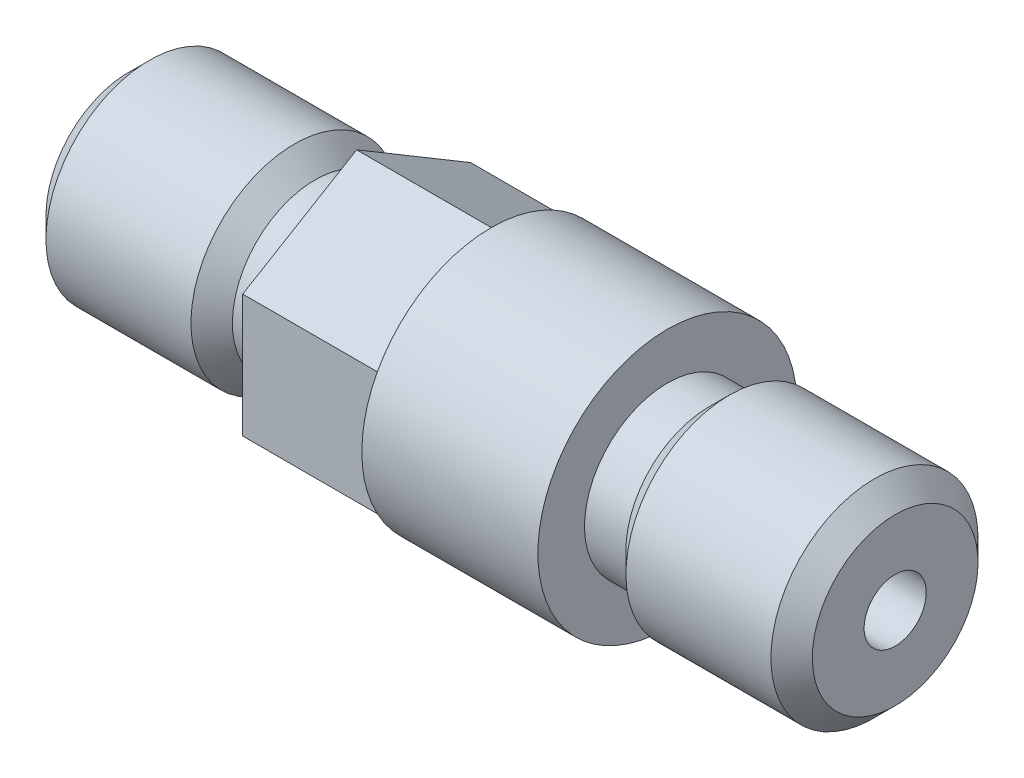
ISO-10303-21;
HEADER;
FILE_DESCRIPTION(('STEP AP214'),'2;1');
FILE_NAME('part.step','',(''),(''),'','','');
FILE_SCHEMA(('AUTOMOTIVE_DESIGN { 1 0 10303 214 1 1 1 1 }'));
ENDSEC;
DATA;
#1=APPLICATION_CONTEXT('core data for automotive mechanical design processes');
#2=APPLICATION_PROTOCOL_DEFINITION('international standard','automotive_design',2000,#1);
#3=PRODUCT_CONTEXT('',#1,'mechanical');
#4=PRODUCT('Part','Part','',(#3));
#5=PRODUCT_RELATED_PRODUCT_CATEGORY('part','',(#4));
#6=PRODUCT_DEFINITION_FORMATION('','',#4);
#7=PRODUCT_DEFINITION_CONTEXT('part definition',#1,'design');
#8=PRODUCT_DEFINITION('design','',#6,#7);
#9=PRODUCT_DEFINITION_SHAPE('','',#8);
#10=(LENGTH_UNIT() NAMED_UNIT(*) SI_UNIT(.MILLI.,.METRE.));
#11=(NAMED_UNIT(*) PLANE_ANGLE_UNIT() SI_UNIT($,.RADIAN.));
#12=(NAMED_UNIT(*) SI_UNIT($,.STERADIAN.) SOLID_ANGLE_UNIT());
#13=UNCERTAINTY_MEASURE_WITH_UNIT(LENGTH_MEASURE(1.E-05),#10,'distance_accuracy_value','');
#14=(GEOMETRIC_REPRESENTATION_CONTEXT(3) GLOBAL_UNCERTAINTY_ASSIGNED_CONTEXT((#13)) GLOBAL_UNIT_ASSIGNED_CONTEXT((#10,
#11,#12)) REPRESENTATION_CONTEXT('',''));
#15=CARTESIAN_POINT('',(0.,0.,0.));
#16=DIRECTION('',(0.,0.,1.));
#17=DIRECTION('',(1.,0.,0.));
#18=AXIS2_PLACEMENT_3D('',#15,#16,#17);
#19=CARTESIAN_POINT('',(-19.5,6.25,0.));
#20=DIRECTION('',(-1.,0.,0.));
#21=DIRECTION('',(0.,-1.,0.));
#22=AXIS2_PLACEMENT_3D('',#19,#20,#21);
#23=PLANE('',#22);
#24=DIRECTION('',(0.,-0.512360379283217,-0.858770540796992));
#25=VECTOR('',#24,1.);
#26=CARTESIAN_POINT('',(-19.5,2.96858552175948,-5.5));
#27=LINE('',#26,#25);
#28=CARTESIAN_POINT('',(-19.5,6.25,0.));
#29=VERTEX_POINT('',#28);
#30=CARTESIAN_POINT('',(-19.5,2.96858552175947,-5.5));
#31=VERTEX_POINT('',#30);
#32=EDGE_CURVE('E121',#29,#31,#27,.T.);
#33=ORIENTED_EDGE('',*,*,#32,.F.);
#34=CARTESIAN_POINT('',(-19.5,0.,0.));
#35=DIRECTION('',(1.,0.,0.));
#36=DIRECTION('',(0.,1.,0.));
#37=AXIS2_PLACEMENT_3D('',#34,#35,#36);
#38=CIRCLE('',#37,6.25);
#39=EDGE_CURVE('E123',#31,#29,#38,.T.);
#40=ORIENTED_EDGE('',*,*,#39,.F.);
#41=EDGE_LOOP('',(#33,#40));
#42=FACE_BOUND('',#41,.T.);
#43=ADVANCED_FACE('F39',(#42),#23,.T.);
#44=DIRECTION('',(0.,0.512360379283217,-0.858770540796992));
#45=VECTOR('',#44,1.);
#46=CARTESIAN_POINT('',(-19.5,6.25,0.));
#47=LINE('',#46,#45);
#48=CARTESIAN_POINT('',(-19.5,2.96858552175947,5.5));
#49=VERTEX_POINT('',#48);
#50=EDGE_CURVE('E118',#49,#29,#47,.T.);
#51=ORIENTED_EDGE('',*,*,#50,.F.);
#52=EDGE_CURVE('E130',#29,#49,#38,.T.);
#53=ORIENTED_EDGE('',*,*,#52,.F.);
#54=EDGE_LOOP('',(#51,#53));
#55=FACE_BOUND('',#54,.T.);
#56=ADVANCED_FACE('F176',(#55),#23,.T.);
#57=DIRECTION('',(0.,1.,0.));
#58=VECTOR('',#57,1.);
#59=CARTESIAN_POINT('',(-19.5,2.96858552175947,5.5));
#60=LINE('',#59,#58);
#61=CARTESIAN_POINT('',(-19.5,-2.96858552175948,5.5));
#62=VERTEX_POINT('',#61);
#63=EDGE_CURVE('E232',#62,#49,#60,.T.);
#64=ORIENTED_EDGE('',*,*,#63,.F.);
#65=EDGE_CURVE('E138',#49,#62,#38,.T.);
#66=ORIENTED_EDGE('',*,*,#65,.F.);
#67=EDGE_LOOP('',(#64,#66));
#68=FACE_BOUND('',#67,.T.);
#69=ADVANCED_FACE('F183',(#68),#23,.T.);
#70=DIRECTION('',(0.,0.512360379283217,0.858770540796992));
#71=VECTOR('',#70,1.);
#72=CARTESIAN_POINT('',(-19.5,-6.25,0.));
#73=LINE('',#72,#71);
#74=CARTESIAN_POINT('',(-19.5,-6.25,0.));
#75=VERTEX_POINT('',#74);
#76=EDGE_CURVE('E62',#75,#62,#73,.T.);
#77=ORIENTED_EDGE('',*,*,#76,.F.);
#78=EDGE_CURVE('E263',#62,#75,#38,.T.);
#79=ORIENTED_EDGE('',*,*,#78,.F.);
#80=EDGE_LOOP('',(#77,#79));
#81=FACE_BOUND('',#80,.T.);
#82=ADVANCED_FACE('F196',(#81),#23,.T.);
#83=DIRECTION('',(0.,-0.512360379283217,0.858770540796992));
#84=VECTOR('',#83,1.);
#85=CARTESIAN_POINT('',(-19.5,-2.96858552175948,-5.5));
#86=LINE('',#85,#84);
#87=CARTESIAN_POINT('',(-19.5,-2.96858552175948,-5.5));
#88=VERTEX_POINT('',#87);
#89=EDGE_CURVE('E203',#88,#75,#86,.T.);
#90=ORIENTED_EDGE('',*,*,#89,.F.);
#91=EDGE_CURVE('E204',#75,#88,#38,.T.);
#92=ORIENTED_EDGE('',*,*,#91,.F.);
#93=EDGE_LOOP('',(#90,#92));
#94=FACE_BOUND('',#93,.T.);
#95=ADVANCED_FACE('F173',(#94),#23,.T.);
#96=CARTESIAN_POINT('',(0.,0.,0.));
#97=DIRECTION('',(1.,0.,0.));
#98=DIRECTION('',(0.,1.,0.));
#99=AXIS2_PLACEMENT_3D('',#96,#97,#98);
#100=PLANE('',#99);
#101=CARTESIAN_POINT('',(0.,0.,0.));
#102=DIRECTION('',(-1.,0.,0.));
#103=DIRECTION('',(0.,-1.,0.));
#104=AXIS2_PLACEMENT_3D('',#101,#102,#103);
#105=CIRCLE('',#104,1.5);
#106=CARTESIAN_POINT('',(0.,-1.5,0.));
#107=VERTEX_POINT('',#106);
#108=EDGE_CURVE('E470',#107,#107,#105,.T.);
#109=ORIENTED_EDGE('',*,*,#108,.T.);
#110=EDGE_LOOP('',(#109));
#111=FACE_BOUND('',#110,.T.);
#112=CARTESIAN_POINT('',(0.,0.,0.));
#113=DIRECTION('',(1.,0.,0.));
#114=DIRECTION('',(0.,1.,0.));
#115=AXIS2_PLACEMENT_3D('',#112,#113,#114);
#116=CIRCLE('',#115,4.);
#117=CARTESIAN_POINT('',(0.,4.,0.));
#118=VERTEX_POINT('',#117);
#119=EDGE_CURVE('E43',#118,#118,#116,.T.);
#120=ORIENTED_EDGE('',*,*,#119,.T.);
#121=EDGE_LOOP('',(#120));
#122=FACE_BOUND('',#121,.T.);
#123=ADVANCED_FACE('F41',(#111,#122),#100,.T.);
#124=CARTESIAN_POINT('',(0.,0.,0.));
#125=DIRECTION('',(-1.,0.,0.));
#126=DIRECTION('',(0.,-1.,0.));
#127=AXIS2_PLACEMENT_3D('',#124,#125,#126);
#128=CONICAL_SURFACE('',#127,4.,0.785398163397447);
#129=CARTESIAN_POINT('',(-1.,0.,0.));
#130=DIRECTION('',(1.,0.,0.));
#131=DIRECTION('',(0.,1.,0.));
#132=AXIS2_PLACEMENT_3D('',#129,#130,#131);
#133=CIRCLE('',#132,5.);
#134=CARTESIAN_POINT('',(-1.,5.,0.));
#135=VERTEX_POINT('',#134);
#136=EDGE_CURVE('E153',#135,#135,#133,.T.);
#137=ORIENTED_EDGE('',*,*,#136,.T.);
#138=EDGE_LOOP('',(#137));
#139=FACE_BOUND('',#138,.T.);
#140=ORIENTED_EDGE('',*,*,#119,.F.);
#141=EDGE_LOOP('',(#140));
#142=FACE_BOUND('',#141,.T.);
#143=ADVANCED_FACE('F163',(#139,#142),#128,.T.);
#144=CARTESIAN_POINT('',(0.,0.,0.));
#145=DIRECTION('',(1.,0.,0.));
#146=DIRECTION('',(0.,1.,0.));
#147=AXIS2_PLACEMENT_3D('',#144,#145,#146);
#148=CYLINDRICAL_SURFACE('',#147,5.);
#149=CARTESIAN_POINT('',(-8.,0.,0.));
#150=DIRECTION('',(1.,0.,0.));
#151=DIRECTION('',(0.,1.,0.));
#152=AXIS2_PLACEMENT_3D('',#149,#150,#151);
#153=CIRCLE('',#152,5.);
#154=CARTESIAN_POINT('',(-8.,5.,0.));
#155=VERTEX_POINT('',#154);
#156=EDGE_CURVE('E150',#155,#155,#153,.T.);
#157=ORIENTED_EDGE('',*,*,#156,.T.);
#158=EDGE_LOOP('',(#157));
#159=FACE_BOUND('',#158,.T.);
#160=ORIENTED_EDGE('',*,*,#136,.F.);
#161=EDGE_LOOP('',(#160));
#162=FACE_BOUND('',#161,.T.);
#163=ADVANCED_FACE('F165',(#159,#162),#148,.T.);
#164=CARTESIAN_POINT('',(-8.,0.,0.));
#165=DIRECTION('',(1.,0.,0.));
#166=DIRECTION('',(0.,1.,0.));
#167=AXIS2_PLACEMENT_3D('',#164,#165,#166);
#168=CONICAL_SURFACE('',#167,5.,0.785398163397453);
#169=CARTESIAN_POINT('',(-9.,0.,0.));
#170=DIRECTION('',(1.,0.,0.));
#171=DIRECTION('',(0.,1.,0.));
#172=AXIS2_PLACEMENT_3D('',#169,#170,#171);
#173=CIRCLE('',#172,3.99999999999999);
#174=CARTESIAN_POINT('',(-9.,3.99999999999999,0.));
#175=VERTEX_POINT('',#174);
#176=EDGE_CURVE('E146',#175,#175,#173,.T.);
#177=ORIENTED_EDGE('',*,*,#176,.T.);
#178=EDGE_LOOP('',(#177));
#179=FACE_BOUND('',#178,.T.);
#180=ORIENTED_EDGE('',*,*,#156,.F.);
#181=EDGE_LOOP('',(#180));
#182=FACE_BOUND('',#181,.T.);
#183=ADVANCED_FACE('F170',(#179,#182),#168,.T.);
#184=CARTESIAN_POINT('',(0.,0.,0.));
#185=DIRECTION('',(1.,0.,0.));
#186=DIRECTION('',(0.,1.,0.));
#187=AXIS2_PLACEMENT_3D('',#184,#185,#186);
#188=CYLINDRICAL_SURFACE('',#187,3.99999999999999);
#189=CARTESIAN_POINT('',(-11.,0.,0.));
#190=DIRECTION('',(1.,0.,0.));
#191=DIRECTION('',(0.,1.,0.));
#192=AXIS2_PLACEMENT_3D('',#189,#190,#191);
#193=CIRCLE('',#192,3.99999999999999);
#194=CARTESIAN_POINT('',(-11.,3.99999999999999,0.));
#195=VERTEX_POINT('',#194);
#196=EDGE_CURVE('E142',#195,#195,#193,.T.);
#197=ORIENTED_EDGE('',*,*,#196,.T.);
#198=EDGE_LOOP('',(#197));
#199=FACE_BOUND('',#198,.T.);
#200=ORIENTED_EDGE('',*,*,#176,.F.);
#201=EDGE_LOOP('',(#200));
#202=FACE_BOUND('',#201,.T.);
#203=ADVANCED_FACE('F273',(#199,#202),#188,.T.);
#204=CARTESIAN_POINT('',(-11.,3.99999999999999,0.));
#205=DIRECTION('',(1.,0.,0.));
#206=DIRECTION('',(0.,1.,0.));
#207=AXIS2_PLACEMENT_3D('',#204,#205,#206);
#208=PLANE('',#207);
#209=CARTESIAN_POINT('',(-11.,0.,0.));
#210=DIRECTION('',(1.,0.,0.));
#211=DIRECTION('',(0.,1.,0.));
#212=AXIS2_PLACEMENT_3D('',#209,#210,#211);
#213=CIRCLE('',#212,6.25);
#214=CARTESIAN_POINT('',(-11.,6.25,0.));
#215=VERTEX_POINT('',#214);
#216=EDGE_CURVE('E137',#215,#215,#213,.T.);
#217=ORIENTED_EDGE('',*,*,#216,.T.);
#218=EDGE_LOOP('',(#217));
#219=FACE_BOUND('',#218,.T.);
#220=ORIENTED_EDGE('',*,*,#196,.F.);
#221=EDGE_LOOP('',(#220));
#222=FACE_BOUND('',#221,.T.);
#223=ADVANCED_FACE('F193',(#219,#222),#208,.T.);
#224=CARTESIAN_POINT('',(0.,0.,0.));
#225=DIRECTION('',(1.,0.,0.));
#226=DIRECTION('',(0.,1.,0.));
#227=AXIS2_PLACEMENT_3D('',#224,#225,#226);
#228=CYLINDRICAL_SURFACE('',#227,6.25);
#229=ORIENTED_EDGE('',*,*,#52,.T.);
#230=ORIENTED_EDGE('',*,*,#65,.T.);
#231=ORIENTED_EDGE('',*,*,#78,.T.);
#232=ORIENTED_EDGE('',*,*,#91,.T.);
#233=EDGE_CURVE('E128',#88,#31,#38,.T.);
#234=ORIENTED_EDGE('',*,*,#233,.T.);
#235=ORIENTED_EDGE('',*,*,#39,.T.);
#236=EDGE_LOOP('',(#229,#230,#231,#232,#234,#235));
#237=FACE_BOUND('',#236,.T.);
#238=ORIENTED_EDGE('',*,*,#216,.F.);
#239=EDGE_LOOP('',(#238));
#240=FACE_BOUND('',#239,.T.);
#241=ADVANCED_FACE('F188',(#237,#240),#228,.T.);
#242=DIRECTION('',(0.,-1.,0.));
#243=VECTOR('',#242,1.);
#244=CARTESIAN_POINT('',(-19.5,2.96858552175948,-5.5));
#245=LINE('',#244,#243);
#246=EDGE_CURVE('E55',#31,#88,#245,.T.);
#247=ORIENTED_EDGE('',*,*,#246,.F.);
#248=ORIENTED_EDGE('',*,*,#233,.F.);
#249=EDGE_LOOP('',(#247,#248));
#250=FACE_BOUND('',#249,.T.);
#251=ADVANCED_FACE('F179',(#250),#23,.T.);
#252=CARTESIAN_POINT('',(-26.,2.96858552175948,-5.5));
#253=DIRECTION('',(0.,-0.858770540796992,0.512360379283217));
#254=DIRECTION('',(0.,-0.512360379283217,-0.858770540796992));
#255=AXIS2_PLACEMENT_3D('',#252,#253,#254);
#256=PLANE('',#255);
#257=ORIENTED_EDGE('',*,*,#32,.T.);
#258=DIRECTION('',(1.,0.,0.));
#259=VECTOR('',#258,1.);
#260=CARTESIAN_POINT('',(-26.,2.96858552175948,-5.5));
#261=LINE('',#260,#259);
#262=CARTESIAN_POINT('',(-26.,2.96858552175948,-5.5));
#263=VERTEX_POINT('',#262);
#264=EDGE_CURVE('E100',#263,#31,#261,.T.);
#265=ORIENTED_EDGE('',*,*,#264,.F.);
#266=DIRECTION('',(0.,-0.512360379283217,-0.858770540796992));
#267=VECTOR('',#266,1.);
#268=CARTESIAN_POINT('',(-26.,2.96858552175948,-5.5));
#269=LINE('',#268,#267);
#270=CARTESIAN_POINT('',(-26.,6.25,0.));
#271=VERTEX_POINT('',#270);
#272=EDGE_CURVE('E108',#271,#263,#269,.T.);
#273=ORIENTED_EDGE('',*,*,#272,.F.);
#274=DIRECTION('',(1.,0.,0.));
#275=VECTOR('',#274,1.);
#276=CARTESIAN_POINT('',(-26.,6.25,0.));
#277=LINE('',#276,#275);
#278=EDGE_CURVE('E226',#271,#29,#277,.T.);
#279=ORIENTED_EDGE('',*,*,#278,.T.);
#280=EDGE_LOOP('',(#257,#265,#273,#279));
#281=FACE_BOUND('',#280,.T.);
#282=ADVANCED_FACE('F120',(#281),#256,.F.);
#283=CARTESIAN_POINT('',(-26.,2.96858552175948,-5.5));
#284=DIRECTION('',(0.,0.,1.));
#285=DIRECTION('',(1.,0.,0.));
#286=AXIS2_PLACEMENT_3D('',#283,#284,#285);
#287=PLANE('',#286);
#288=ORIENTED_EDGE('',*,*,#246,.T.);
#289=DIRECTION('',(1.,0.,0.));
#290=VECTOR('',#289,1.);
#291=CARTESIAN_POINT('',(-26.,-2.96858552175948,-5.5));
#292=LINE('',#291,#290);
#293=CARTESIAN_POINT('',(-26.,-2.96858552175948,-5.5));
#294=VERTEX_POINT('',#293);
#295=EDGE_CURVE('E103',#294,#88,#292,.T.);
#296=ORIENTED_EDGE('',*,*,#295,.F.);
#297=DIRECTION('',(0.,-1.,0.));
#298=VECTOR('',#297,1.);
#299=CARTESIAN_POINT('',(-26.,2.96858552175948,-5.5));
#300=LINE('',#299,#298);
#301=EDGE_CURVE('E96',#263,#294,#300,.T.);
#302=ORIENTED_EDGE('',*,*,#301,.F.);
#303=ORIENTED_EDGE('',*,*,#264,.T.);
#304=EDGE_LOOP('',(#288,#296,#302,#303));
#305=FACE_BOUND('',#304,.T.);
#306=ADVANCED_FACE('F98',(#305),#287,.F.);
#307=CARTESIAN_POINT('',(-26.,-2.96858552175948,-5.5));
#308=DIRECTION('',(0.,0.858770540796992,0.512360379283217));
#309=DIRECTION('',(0.,-0.512360379283217,0.858770540796992));
#310=AXIS2_PLACEMENT_3D('',#307,#308,#309);
#311=PLANE('',#310);
#312=ORIENTED_EDGE('',*,*,#89,.T.);
#313=DIRECTION('',(1.,0.,0.));
#314=VECTOR('',#313,1.);
#315=CARTESIAN_POINT('',(-26.,-6.25,0.));
#316=LINE('',#315,#314);
#317=CARTESIAN_POINT('',(-26.,-6.25,0.));
#318=VERTEX_POINT('',#317);
#319=EDGE_CURVE('E131',#318,#75,#316,.T.);
#320=ORIENTED_EDGE('',*,*,#319,.F.);
#321=DIRECTION('',(0.,-0.512360379283217,0.858770540796992));
#322=VECTOR('',#321,1.);
#323=CARTESIAN_POINT('',(-26.,-2.96858552175948,-5.5));
#324=LINE('',#323,#322);
#325=EDGE_CURVE('E107',#294,#318,#324,.T.);
#326=ORIENTED_EDGE('',*,*,#325,.F.);
#327=ORIENTED_EDGE('',*,*,#295,.T.);
#328=EDGE_LOOP('',(#312,#320,#326,#327));
#329=FACE_BOUND('',#328,.T.);
#330=ADVANCED_FACE('F213',(#329),#311,.F.);
#331=CARTESIAN_POINT('',(-26.,-6.25,0.));
#332=DIRECTION('',(0.,0.858770540796992,-0.512360379283217));
#333=DIRECTION('',(0.,0.512360379283217,0.858770540796992));
#334=AXIS2_PLACEMENT_3D('',#331,#332,#333);
#335=PLANE('',#334);
#336=ORIENTED_EDGE('',*,*,#76,.T.);
#337=DIRECTION('',(1.,0.,0.));
#338=VECTOR('',#337,1.);
#339=CARTESIAN_POINT('',(-26.,-2.96858552175948,5.5));
#340=LINE('',#339,#338);
#341=CARTESIAN_POINT('',(-26.,-2.96858552175948,5.5));
#342=VERTEX_POINT('',#341);
#343=EDGE_CURVE('E245',#342,#62,#340,.T.);
#344=ORIENTED_EDGE('',*,*,#343,.F.);
#345=DIRECTION('',(0.,0.512360379283217,0.858770540796992));
#346=VECTOR('',#345,1.);
#347=CARTESIAN_POINT('',(-26.,-6.25,0.));
#348=LINE('',#347,#346);
#349=EDGE_CURVE('E216',#318,#342,#348,.T.);
#350=ORIENTED_EDGE('',*,*,#349,.F.);
#351=ORIENTED_EDGE('',*,*,#319,.T.);
#352=EDGE_LOOP('',(#336,#344,#350,#351));
#353=FACE_BOUND('',#352,.T.);
#354=ADVANCED_FACE('F250',(#353),#335,.F.);
#355=CARTESIAN_POINT('',(-26.,2.96858552175947,5.5));
#356=DIRECTION('',(0.,0.,-1.));
#357=DIRECTION('',(-1.,0.,0.));
#358=AXIS2_PLACEMENT_3D('',#355,#356,#357);
#359=PLANE('',#358);
#360=ORIENTED_EDGE('',*,*,#63,.T.);
#361=DIRECTION('',(1.,0.,0.));
#362=VECTOR('',#361,1.);
#363=CARTESIAN_POINT('',(-26.,2.96858552175947,5.5));
#364=LINE('',#363,#362);
#365=CARTESIAN_POINT('',(-26.,2.96858552175947,5.5));
#366=VERTEX_POINT('',#365);
#367=EDGE_CURVE('E241',#366,#49,#364,.T.);
#368=ORIENTED_EDGE('',*,*,#367,.F.);
#369=DIRECTION('',(0.,1.,0.));
#370=VECTOR('',#369,1.);
#371=CARTESIAN_POINT('',(-26.,2.96858552175947,5.5));
#372=LINE('',#371,#370);
#373=EDGE_CURVE('E219',#342,#366,#372,.T.);
#374=ORIENTED_EDGE('',*,*,#373,.F.);
#375=ORIENTED_EDGE('',*,*,#343,.T.);
#376=EDGE_LOOP('',(#360,#368,#374,#375));
#377=FACE_BOUND('',#376,.T.);
#378=ADVANCED_FACE('F255',(#377),#359,.F.);
#379=CARTESIAN_POINT('',(-26.,6.25,0.));
#380=DIRECTION('',(0.,-0.858770540796992,-0.512360379283217));
#381=DIRECTION('',(0.,0.512360379283217,-0.858770540796992));
#382=AXIS2_PLACEMENT_3D('',#379,#380,#381);
#383=PLANE('',#382);
#384=ORIENTED_EDGE('',*,*,#50,.T.);
#385=ORIENTED_EDGE('',*,*,#278,.F.);
#386=DIRECTION('',(0.,0.512360379283217,-0.858770540796992));
#387=VECTOR('',#386,1.);
#388=CARTESIAN_POINT('',(-26.,6.25,0.));
#389=LINE('',#388,#387);
#390=EDGE_CURVE('E113',#366,#271,#389,.T.);
#391=ORIENTED_EDGE('',*,*,#390,.F.);
#392=ORIENTED_EDGE('',*,*,#367,.T.);
#393=EDGE_LOOP('',(#384,#385,#391,#392));
#394=FACE_BOUND('',#393,.T.);
#395=ADVANCED_FACE('F257',(#394),#383,.F.);
#396=CARTESIAN_POINT('',(-26.,0.,0.));
#397=DIRECTION('',(1.,0.,0.));
#398=DIRECTION('',(0.,0.,-1.));
#399=AXIS2_PLACEMENT_3D('',#396,#397,#398);
#400=PLANE('',#399);
#401=CARTESIAN_POINT('',(-26.,0.,0.));
#402=DIRECTION('',(-1.,0.,0.));
#403=DIRECTION('',(0.,-1.,0.));
#404=AXIS2_PLACEMENT_3D('',#401,#402,#403);
#405=CIRCLE('',#404,3.99999999999999);
#406=CARTESIAN_POINT('',(-26.,-3.99999999999999,0.));
#407=VERTEX_POINT('',#406);
#408=EDGE_CURVE('E11',#407,#407,#405,.T.);
#409=ORIENTED_EDGE('',*,*,#408,.F.);
#410=EDGE_LOOP('',(#409));
#411=FACE_BOUND('',#410,.T.);
#412=ORIENTED_EDGE('',*,*,#272,.T.);
#413=ORIENTED_EDGE('',*,*,#301,.T.);
#414=ORIENTED_EDGE('',*,*,#325,.T.);
#415=ORIENTED_EDGE('',*,*,#349,.T.);
#416=ORIENTED_EDGE('',*,*,#373,.T.);
#417=ORIENTED_EDGE('',*,*,#390,.T.);
#418=EDGE_LOOP('',(#412,#413,#414,#415,#416,#417));
#419=FACE_BOUND('',#418,.T.);
#420=ADVANCED_FACE('F111',(#411,#419),#400,.F.);
#421=CARTESIAN_POINT('',(-29.,0.,0.));
#422=DIRECTION('',(-1.,0.,0.));
#423=DIRECTION('',(0.,-1.,0.));
#424=AXIS2_PLACEMENT_3D('',#421,#422,#423);
#425=CYLINDRICAL_SURFACE('',#424,3.99999999999999);
#426=CARTESIAN_POINT('',(-28.,0.,0.));
#427=DIRECTION('',(-1.,0.,0.));
#428=DIRECTION('',(0.,-1.,0.));
#429=AXIS2_PLACEMENT_3D('',#426,#427,#428);
#430=CIRCLE('',#429,3.99999999999999);
#431=CARTESIAN_POINT('',(-28.,-3.99999999999999,0.));
#432=VERTEX_POINT('',#431);
#433=EDGE_CURVE('E228',#432,#432,#430,.T.);
#434=ORIENTED_EDGE('',*,*,#433,.F.);
#435=EDGE_LOOP('',(#434));
#436=FACE_BOUND('',#435,.T.);
#437=ORIENTED_EDGE('',*,*,#408,.T.);
#438=EDGE_LOOP('',(#437));
#439=FACE_BOUND('',#438,.T.);
#440=ADVANCED_FACE('F366',(#436,#439),#425,.T.);
#441=CARTESIAN_POINT('',(-28.,0.,0.));
#442=DIRECTION('',(-1.,0.,0.));
#443=DIRECTION('',(0.,-1.,0.));
#444=AXIS2_PLACEMENT_3D('',#441,#442,#443);
#445=CONICAL_SURFACE('',#444,3.99999999999999,0.785398163397449);
#446=CARTESIAN_POINT('',(-29.,0.,0.));
#447=DIRECTION('',(-1.,0.,0.));
#448=DIRECTION('',(0.,-1.,0.));
#449=AXIS2_PLACEMENT_3D('',#446,#447,#448);
#450=CIRCLE('',#449,4.99999999999999);
#451=CARTESIAN_POINT('',(-29.,-4.99999999999999,0.));
#452=VERTEX_POINT('',#451);
#453=EDGE_CURVE('E499',#452,#452,#450,.T.);
#454=ORIENTED_EDGE('',*,*,#453,.F.);
#455=EDGE_LOOP('',(#454));
#456=FACE_BOUND('',#455,.T.);
#457=ORIENTED_EDGE('',*,*,#433,.T.);
#458=EDGE_LOOP('',(#457));
#459=FACE_BOUND('',#458,.T.);
#460=ADVANCED_FACE('F376',(#456,#459),#445,.T.);
#461=CARTESIAN_POINT('',(-29.,0.,0.));
#462=DIRECTION('',(-1.,0.,0.));
#463=DIRECTION('',(0.,-1.,0.));
#464=AXIS2_PLACEMENT_3D('',#461,#462,#463);
#465=CYLINDRICAL_SURFACE('',#464,4.99999999999999);
#466=CARTESIAN_POINT('',(-36.,0.,0.));
#467=DIRECTION('',(-1.,0.,0.));
#468=DIRECTION('',(0.,-1.,0.));
#469=AXIS2_PLACEMENT_3D('',#466,#467,#468);
#470=CIRCLE('',#469,4.99999999999999);
#471=CARTESIAN_POINT('',(-36.,-4.99999999999998,0.));
#472=VERTEX_POINT('',#471);
#473=EDGE_CURVE('E495',#472,#472,#470,.T.);
#474=ORIENTED_EDGE('',*,*,#473,.F.);
#475=EDGE_LOOP('',(#474));
#476=FACE_BOUND('',#475,.T.);
#477=ORIENTED_EDGE('',*,*,#453,.T.);
#478=EDGE_LOOP('',(#477));
#479=FACE_BOUND('',#478,.T.);
#480=ADVANCED_FACE('F386',(#476,#479),#465,.T.);
#481=CARTESIAN_POINT('',(-36.,0.,0.));
#482=DIRECTION('',(1.,0.,0.));
#483=DIRECTION('',(0.,1.,0.));
#484=AXIS2_PLACEMENT_3D('',#481,#482,#483);
#485=CONICAL_SURFACE('',#484,4.99999999999999,0.785398163397451);
#486=CARTESIAN_POINT('',(-37.,0.,0.));
#487=DIRECTION('',(-1.,0.,0.));
#488=DIRECTION('',(0.,-1.,0.));
#489=AXIS2_PLACEMENT_3D('',#486,#487,#488);
#490=CIRCLE('',#489,3.99999999999998);
#491=CARTESIAN_POINT('',(-37.,-3.99999999999998,0.));
#492=VERTEX_POINT('',#491);
#493=EDGE_CURVE('E491',#492,#492,#490,.T.);
#494=ORIENTED_EDGE('',*,*,#493,.F.);
#495=EDGE_LOOP('',(#494));
#496=FACE_BOUND('',#495,.T.);
#497=ORIENTED_EDGE('',*,*,#473,.T.);
#498=EDGE_LOOP('',(#497));
#499=FACE_BOUND('',#498,.T.);
#500=ADVANCED_FACE('F396',(#496,#499),#485,.T.);
#501=CARTESIAN_POINT('',(-37.,2.49999999999999,0.));
#502=DIRECTION('',(1.,0.,0.));
#503=DIRECTION('',(0.,1.,0.));
#504=AXIS2_PLACEMENT_3D('',#501,#502,#503);
#505=PLANE('',#504);
#506=CARTESIAN_POINT('',(-37.,0.,0.));
#507=DIRECTION('',(-1.,0.,0.));
#508=DIRECTION('',(0.,-1.,0.));
#509=AXIS2_PLACEMENT_3D('',#506,#507,#508);
#510=CIRCLE('',#509,2.49999999999999);
#511=CARTESIAN_POINT('',(-37.,-2.49999999999998,0.));
#512=VERTEX_POINT('',#511);
#513=EDGE_CURVE('E487',#512,#512,#510,.T.);
#514=ORIENTED_EDGE('',*,*,#513,.F.);
#515=EDGE_LOOP('',(#514));
#516=FACE_BOUND('',#515,.T.);
#517=ORIENTED_EDGE('',*,*,#493,.T.);
#518=EDGE_LOOP('',(#517));
#519=FACE_BOUND('',#518,.T.);
#520=ADVANCED_FACE('F406',(#516,#519),#505,.F.);
#521=CARTESIAN_POINT('',(-29.,0.,0.));
#522=DIRECTION('',(-1.,0.,0.));
#523=DIRECTION('',(0.,-1.,0.));
#524=AXIS2_PLACEMENT_3D('',#521,#522,#523);
#525=CYLINDRICAL_SURFACE('',#524,2.49999999999999);
#526=CARTESIAN_POINT('',(-29.7071067811865,0.,0.));
#527=DIRECTION('',(-1.,0.,0.));
#528=DIRECTION('',(0.,-1.,0.));
#529=AXIS2_PLACEMENT_3D('',#526,#527,#528);
#530=CIRCLE('',#529,2.49999999999999);
#531=CARTESIAN_POINT('',(-29.7071067811865,-2.49999999999999,0.));
#532=VERTEX_POINT('',#531);
#533=EDGE_CURVE('E483',#532,#532,#530,.T.);
#534=ORIENTED_EDGE('',*,*,#533,.F.);
#535=EDGE_LOOP('',(#534));
#536=FACE_BOUND('',#535,.T.);
#537=ORIENTED_EDGE('',*,*,#513,.T.);
#538=EDGE_LOOP('',(#537));
#539=FACE_BOUND('',#538,.T.);
#540=ADVANCED_FACE('F416',(#536,#539),#525,.F.);
#541=CARTESIAN_POINT('',(-29.7071067811865,0.,0.));
#542=DIRECTION('',(-1.,0.,0.));
#543=DIRECTION('',(0.,-1.,0.));
#544=AXIS2_PLACEMENT_3D('',#541,#542,#543);
#545=CONICAL_SURFACE('',#544,2.49999999999999,0.785398163397444);
#546=CARTESIAN_POINT('',(-29.,0.,0.));
#547=DIRECTION('',(-1.,0.,0.));
#548=DIRECTION('',(0.,-1.,0.));
#549=AXIS2_PLACEMENT_3D('',#546,#547,#548);
#550=CIRCLE('',#549,1.79289321881345);
#551=CARTESIAN_POINT('',(-29.,-1.79289321881345,0.));
#552=VERTEX_POINT('',#551);
#553=EDGE_CURVE('E477',#552,#552,#550,.T.);
#554=ORIENTED_EDGE('',*,*,#553,.F.);
#555=EDGE_LOOP('',(#554));
#556=FACE_BOUND('',#555,.T.);
#557=ORIENTED_EDGE('',*,*,#533,.T.);
#558=EDGE_LOOP('',(#557));
#559=FACE_BOUND('',#558,.T.);
#560=ADVANCED_FACE('F426',(#556,#559),#545,.F.);
#561=CARTESIAN_POINT('',(-29.,0.,0.));
#562=DIRECTION('',(1.,0.,0.));
#563=DIRECTION('',(0.,1.,0.));
#564=AXIS2_PLACEMENT_3D('',#561,#562,#563);
#565=PLANE('',#564);
#566=CARTESIAN_POINT('',(-29.,0.,0.));
#567=DIRECTION('',(-1.,0.,0.));
#568=DIRECTION('',(0.,-1.,0.));
#569=AXIS2_PLACEMENT_3D('',#566,#567,#568);
#570=CIRCLE('',#569,1.5);
#571=CARTESIAN_POINT('',(-29.,-1.49999999999998,0.));
#572=VERTEX_POINT('',#571);
#573=EDGE_CURVE('E473',#572,#572,#570,.T.);
#574=ORIENTED_EDGE('',*,*,#573,.F.);
#575=EDGE_LOOP('',(#574));
#576=FACE_BOUND('',#575,.T.);
#577=ORIENTED_EDGE('',*,*,#553,.T.);
#578=EDGE_LOOP('',(#577));
#579=FACE_BOUND('',#578,.T.);
#580=ADVANCED_FACE('F436',(#576,#579),#565,.F.);
#581=CARTESIAN_POINT('',(0.,0.,0.));
#582=DIRECTION('',(-1.,0.,0.));
#583=DIRECTION('',(0.,-1.,0.));
#584=AXIS2_PLACEMENT_3D('',#581,#582,#583);
#585=CYLINDRICAL_SURFACE('',#584,1.5);
#586=CARTESIAN_POINT('',(0.,-1.5,0.));
#587=CARTESIAN_POINT('',(-0.30208333333333,-1.5,0.));
#588=CARTESIAN_POINT('',(-0.604166666666664,-1.5,0.));
#589=CARTESIAN_POINT('',(-1.20833333333333,-1.5,0.));
#590=CARTESIAN_POINT('',(-1.51041666666666,-1.5,0.));
#591=CARTESIAN_POINT('',(-2.11458333333333,-1.5,0.));
#592=CARTESIAN_POINT('',(-2.41666666666666,-1.5,0.));
#593=CARTESIAN_POINT('',(-3.02083333333333,-1.5,0.));
#594=CARTESIAN_POINT('',(-3.32291666666666,-1.5,0.));
#595=CARTESIAN_POINT('',(-3.92708333333333,-1.5,0.));
#596=CARTESIAN_POINT('',(-4.22916666666666,-1.5,0.));
#597=CARTESIAN_POINT('',(-4.83333333333333,-1.5,0.));
#598=CARTESIAN_POINT('',(-5.13541666666666,-1.5,0.));
#599=CARTESIAN_POINT('',(-5.73958333333333,-1.5,0.));
#600=CARTESIAN_POINT('',(-6.04166666666666,-1.5,0.));
#601=CARTESIAN_POINT('',(-6.64583333333333,-1.5,0.));
#602=CARTESIAN_POINT('',(-6.94791666666666,-1.5,0.));
#603=CARTESIAN_POINT('',(-7.55208333333333,-1.49999999999999,0.));
#604=CARTESIAN_POINT('',(-7.85416666666666,-1.49999999999999,0.));
#605=CARTESIAN_POINT('',(-8.45833333333333,-1.49999999999999,0.));
#606=CARTESIAN_POINT('',(-8.76041666666666,-1.49999999999999,0.));
#607=CARTESIAN_POINT('',(-9.36458333333333,-1.49999999999999,0.));
#608=CARTESIAN_POINT('',(-9.66666666666666,-1.49999999999999,0.));
#609=CARTESIAN_POINT('',(-10.2708333333333,-1.49999999999999,0.));
#610=CARTESIAN_POINT('',(-10.5729166666667,-1.49999999999999,0.));
#611=CARTESIAN_POINT('',(-11.1770833333333,-1.49999999999999,0.));
#612=CARTESIAN_POINT('',(-11.4791666666667,-1.49999999999999,0.));
#613=CARTESIAN_POINT('',(-12.0833333333333,-1.49999999999999,0.));
#614=CARTESIAN_POINT('',(-12.3854166666667,-1.49999999999999,0.));
#615=CARTESIAN_POINT('',(-12.9895833333333,-1.49999999999999,0.));
#616=CARTESIAN_POINT('',(-13.2916666666667,-1.49999999999999,0.));
#617=CARTESIAN_POINT('',(-13.8958333333333,-1.49999999999999,0.));
#618=CARTESIAN_POINT('',(-14.1979166666667,-1.49999999999999,0.));
#619=CARTESIAN_POINT('',(-14.8020833333333,-1.49999999999999,0.));
#620=CARTESIAN_POINT('',(-15.1041666666667,-1.49999999999999,0.));
#621=CARTESIAN_POINT('',(-15.7083333333333,-1.49999999999999,0.));
#622=CARTESIAN_POINT('',(-16.0104166666667,-1.49999999999999,0.));
#623=CARTESIAN_POINT('',(-16.6145833333333,-1.49999999999999,0.));
#624=CARTESIAN_POINT('',(-16.9166666666667,-1.49999999999999,0.));
#625=CARTESIAN_POINT('',(-17.5208333333333,-1.49999999999999,0.));
#626=CARTESIAN_POINT('',(-17.8229166666667,-1.49999999999999,0.));
#627=CARTESIAN_POINT('',(-18.4270833333333,-1.49999999999999,0.));
#628=CARTESIAN_POINT('',(-18.7291666666667,-1.49999999999999,0.));
#629=CARTESIAN_POINT('',(-19.3333333333333,-1.49999999999999,0.));
#630=CARTESIAN_POINT('',(-19.6354166666667,-1.49999999999999,0.));
#631=CARTESIAN_POINT('',(-20.2395833333333,-1.49999999999999,0.));
#632=CARTESIAN_POINT('',(-20.5416666666667,-1.49999999999999,0.));
#633=CARTESIAN_POINT('',(-21.1458333333333,-1.49999999999999,0.));
#634=CARTESIAN_POINT('',(-21.4479166666667,-1.49999999999998,0.));
#635=CARTESIAN_POINT('',(-22.0520833333333,-1.49999999999998,0.));
#636=CARTESIAN_POINT('',(-22.3541666666667,-1.49999999999998,0.));
#637=CARTESIAN_POINT('',(-22.9583333333333,-1.49999999999998,0.));
#638=CARTESIAN_POINT('',(-23.2604166666667,-1.49999999999998,0.));
#639=CARTESIAN_POINT('',(-23.8645833333333,-1.49999999999998,0.));
#640=CARTESIAN_POINT('',(-24.1666666666667,-1.49999999999998,0.));
#641=CARTESIAN_POINT('',(-24.7708333333333,-1.49999999999998,0.));
#642=CARTESIAN_POINT('',(-25.0729166666667,-1.49999999999998,0.));
#643=CARTESIAN_POINT('',(-25.6770833333333,-1.49999999999998,0.));
#644=CARTESIAN_POINT('',(-25.9791666666667,-1.49999999999998,0.));
#645=CARTESIAN_POINT('',(-26.5833333333333,-1.49999999999998,0.));
#646=CARTESIAN_POINT('',(-26.8854166666667,-1.49999999999998,0.));
#647=CARTESIAN_POINT('',(-27.4895833333333,-1.49999999999998,0.));
#648=CARTESIAN_POINT('',(-27.7916666666667,-1.49999999999998,0.));
#649=CARTESIAN_POINT('',(-28.3958333333333,-1.49999999999998,0.));
#650=CARTESIAN_POINT('',(-28.6979166666667,-1.49999999999998,0.));
#651=CARTESIAN_POINT('',(-29.,-1.49999999999998,0.));
#652=B_SPLINE_CURVE_WITH_KNOTS('',3,(#586,#587,#588,#589,#590,#591,#592,#593,#594,#595,#596,
#597,#598,#599,#600,#601,#602,#603,#604,#605,#606,#607,#608,#609,#610,#611,#612,#613,#614,#615,
#616,#617,#618,#619,#620,#621,#622,#623,#624,#625,#626,#627,#628,#629,#630,#631,#632,#633,#634,
#635,#636,#637,#638,#639,#640,#641,#642,#643,#644,#645,#646,#647,#648,#649,#650,#651),
.UNSPECIFIED.,.F.,.F.,(4,2,2,2,2,2,2,2,2,2,2,2,2,2,2,2,2,2,2,2,2,2,2,2,2,2,2,2,2,2,2,2,4),(0.,
0.90625,1.8125,2.71875,3.625,4.53125,5.4375,6.34375,7.25,8.15625,9.0625,9.96875,10.875,11.78125,
12.6875,13.59375,14.5,15.40625,16.3125,17.21875,18.125,19.03125,19.9375,20.84375,21.75,22.65625,
23.5625,24.46875,25.375,26.28125,27.1875,28.09375,29.),.UNSPECIFIED.);
#653=EDGE_CURVE('BSEAM453',#107,#572,#652,.T.);
#654=ORIENTED_EDGE('',*,*,#108,.F.);
#655=ORIENTED_EDGE('',*,*,#573,.T.);
#656=ORIENTED_EDGE('',*,*,#653,.T.);
#657=ORIENTED_EDGE('',*,*,#653,.F.);
#658=EDGE_LOOP('',(#654,#656,#655,#657));
#659=FACE_BOUND('',#658,.T.);
#660=ADVANCED_FACE('F453',(#659),#585,.F.);
#661=CLOSED_SHELL('',(#43,#56,#69,#82,#95,#123,#143,#163,#183,#203,#223,#241,#251,#282,#306,
#330,#354,#378,#395,#420,#440,#460,#480,#500,#520,#540,#560,#580,#660));
#662=MANIFOLD_SOLID_BREP('B2',#661);
#663=ADVANCED_BREP_SHAPE_REPRESENTATION('',(#18,#662),#14);
#664=SHAPE_DEFINITION_REPRESENTATION(#9,#663);
ENDSEC;
END-ISO-10303-21;
